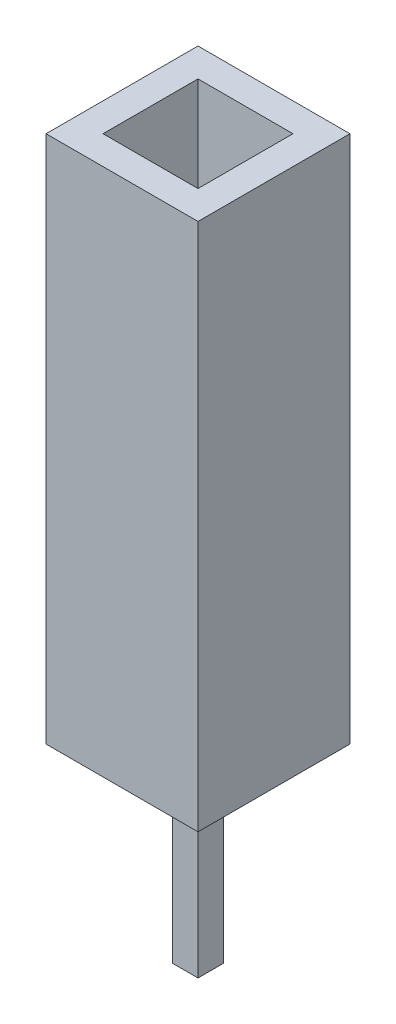
ISO-10303-21;
HEADER;
FILE_DESCRIPTION(('STEP AP214'),'2;1');
FILE_NAME('part.step','',(''),(''),'','','');
FILE_SCHEMA(('AUTOMOTIVE_DESIGN { 1 0 10303 214 1 1 1 1 }'));
ENDSEC;
DATA;
#1=APPLICATION_CONTEXT('core data for automotive mechanical design processes');
#2=APPLICATION_PROTOCOL_DEFINITION('international standard','automotive_design',2000,#1);
#3=PRODUCT_CONTEXT('',#1,'mechanical');
#4=PRODUCT('Part','Part','',(#3));
#5=PRODUCT_RELATED_PRODUCT_CATEGORY('part','',(#4));
#6=PRODUCT_DEFINITION_FORMATION('','',#4);
#7=PRODUCT_DEFINITION_CONTEXT('part definition',#1,'design');
#8=PRODUCT_DEFINITION('design','',#6,#7);
#9=PRODUCT_DEFINITION_SHAPE('','',#8);
#10=(LENGTH_UNIT() NAMED_UNIT(*) SI_UNIT(.MILLI.,.METRE.));
#11=(NAMED_UNIT(*) PLANE_ANGLE_UNIT() SI_UNIT($,.RADIAN.));
#12=(NAMED_UNIT(*) SI_UNIT($,.STERADIAN.) SOLID_ANGLE_UNIT());
#13=UNCERTAINTY_MEASURE_WITH_UNIT(LENGTH_MEASURE(1.E-05),#10,'distance_accuracy_value','');
#14=(GEOMETRIC_REPRESENTATION_CONTEXT(3) GLOBAL_UNCERTAINTY_ASSIGNED_CONTEXT((#13)) GLOBAL_UNIT_ASSIGNED_CONTEXT((#10,
#11,#12)) REPRESENTATION_CONTEXT('',''));
#15=CARTESIAN_POINT('',(0.,0.,0.));
#16=DIRECTION('',(0.,0.,1.));
#17=DIRECTION('',(1.,0.,0.));
#18=AXIS2_PLACEMENT_3D('',#15,#16,#17);
#19=CARTESIAN_POINT('',(-1.2,8.35,-1.2));
#20=DIRECTION('',(1.,0.,0.));
#21=DIRECTION('',(0.,0.,-1.));
#22=AXIS2_PLACEMENT_3D('',#19,#20,#21);
#23=PLANE('',#22);
#24=DIRECTION('',(0.,0.,1.));
#25=VECTOR('',#24,1.);
#26=CARTESIAN_POINT('',(-1.2,0.,-1.2));
#27=LINE('',#26,#25);
#28=CARTESIAN_POINT('',(-1.2,0.,-1.2));
#29=VERTEX_POINT('',#28);
#30=CARTESIAN_POINT('',(-1.2,0.,1.2));
#31=VERTEX_POINT('',#30);
#32=EDGE_CURVE('E181',#29,#31,#27,.T.);
#33=ORIENTED_EDGE('',*,*,#32,.T.);
#34=DIRECTION('',(0.,-1.,0.));
#35=VECTOR('',#34,1.);
#36=CARTESIAN_POINT('',(-1.2,8.35,1.2));
#37=LINE('',#36,#35);
#38=CARTESIAN_POINT('',(-1.2,8.35,1.2));
#39=VERTEX_POINT('',#38);
#40=EDGE_CURVE('E11',#39,#31,#37,.T.);
#41=ORIENTED_EDGE('',*,*,#40,.F.);
#42=DIRECTION('',(0.,0.,1.));
#43=VECTOR('',#42,1.);
#44=CARTESIAN_POINT('',(-1.2,8.35,-1.2));
#45=LINE('',#44,#43);
#46=CARTESIAN_POINT('',(-1.2,8.35,-1.2));
#47=VERTEX_POINT('',#46);
#48=EDGE_CURVE('E188',#47,#39,#45,.T.);
#49=ORIENTED_EDGE('',*,*,#48,.F.);
#50=DIRECTION('',(0.,-1.,0.));
#51=VECTOR('',#50,1.);
#52=CARTESIAN_POINT('',(-1.2,8.35,-1.2));
#53=LINE('',#52,#51);
#54=EDGE_CURVE('E198',#47,#29,#53,.T.);
#55=ORIENTED_EDGE('',*,*,#54,.T.);
#56=EDGE_LOOP('',(#33,#41,#49,#55));
#57=FACE_BOUND('',#56,.T.);
#58=ADVANCED_FACE('F42',(#57),#23,.F.);
#59=CARTESIAN_POINT('',(1.2,8.35,1.2));
#60=DIRECTION('',(0.,0.,-1.));
#61=DIRECTION('',(-1.,0.,0.));
#62=AXIS2_PLACEMENT_3D('',#59,#60,#61);
#63=PLANE('',#62);
#64=DIRECTION('',(1.,0.,0.));
#65=VECTOR('',#64,1.);
#66=CARTESIAN_POINT('',(1.2,0.,1.2));
#67=LINE('',#66,#65);
#68=CARTESIAN_POINT('',(1.2,0.,1.2));
#69=VERTEX_POINT('',#68);
#70=EDGE_CURVE('E201',#31,#69,#67,.T.);
#71=ORIENTED_EDGE('',*,*,#70,.T.);
#72=DIRECTION('',(0.,-1.,0.));
#73=VECTOR('',#72,1.);
#74=CARTESIAN_POINT('',(1.2,8.35,1.2));
#75=LINE('',#74,#73);
#76=CARTESIAN_POINT('',(1.2,8.35,1.2));
#77=VERTEX_POINT('',#76);
#78=EDGE_CURVE('E49',#77,#69,#75,.T.);
#79=ORIENTED_EDGE('',*,*,#78,.F.);
#80=DIRECTION('',(1.,0.,0.));
#81=VECTOR('',#80,1.);
#82=CARTESIAN_POINT('',(1.2,8.35,1.2));
#83=LINE('',#82,#81);
#84=EDGE_CURVE('E191',#39,#77,#83,.T.);
#85=ORIENTED_EDGE('',*,*,#84,.F.);
#86=ORIENTED_EDGE('',*,*,#40,.T.);
#87=EDGE_LOOP('',(#71,#79,#85,#86));
#88=FACE_BOUND('',#87,.T.);
#89=ADVANCED_FACE('F231',(#88),#63,.F.);
#90=CARTESIAN_POINT('',(1.2,8.35,-1.2));
#91=DIRECTION('',(-1.,0.,0.));
#92=DIRECTION('',(0.,0.,1.));
#93=AXIS2_PLACEMENT_3D('',#90,#91,#92);
#94=PLANE('',#93);
#95=DIRECTION('',(0.,0.,-1.));
#96=VECTOR('',#95,1.);
#97=CARTESIAN_POINT('',(1.2,0.,-1.2));
#98=LINE('',#97,#96);
#99=CARTESIAN_POINT('',(1.2,0.,-1.2));
#100=VERTEX_POINT('',#99);
#101=EDGE_CURVE('E203',#69,#100,#98,.T.);
#102=ORIENTED_EDGE('',*,*,#101,.T.);
#103=DIRECTION('',(0.,-1.,0.));
#104=VECTOR('',#103,1.);
#105=CARTESIAN_POINT('',(1.2,8.35,-1.2));
#106=LINE('',#105,#104);
#107=CARTESIAN_POINT('',(1.2,8.35,-1.2));
#108=VERTEX_POINT('',#107);
#109=EDGE_CURVE('E208',#108,#100,#106,.T.);
#110=ORIENTED_EDGE('',*,*,#109,.F.);
#111=DIRECTION('',(0.,0.,-1.));
#112=VECTOR('',#111,1.);
#113=CARTESIAN_POINT('',(1.2,8.35,-1.2));
#114=LINE('',#113,#112);
#115=EDGE_CURVE('E194',#77,#108,#114,.T.);
#116=ORIENTED_EDGE('',*,*,#115,.F.);
#117=ORIENTED_EDGE('',*,*,#78,.T.);
#118=EDGE_LOOP('',(#102,#110,#116,#117));
#119=FACE_BOUND('',#118,.T.);
#120=ADVANCED_FACE('F215',(#119),#94,.F.);
#121=CARTESIAN_POINT('',(1.2,8.35,-1.2));
#122=DIRECTION('',(0.,0.,1.));
#123=DIRECTION('',(1.,0.,0.));
#124=AXIS2_PLACEMENT_3D('',#121,#122,#123);
#125=PLANE('',#124);
#126=DIRECTION('',(-1.,0.,0.));
#127=VECTOR('',#126,1.);
#128=CARTESIAN_POINT('',(1.2,0.,-1.2));
#129=LINE('',#128,#127);
#130=EDGE_CURVE('E192',#100,#29,#129,.T.);
#131=ORIENTED_EDGE('',*,*,#130,.T.);
#132=ORIENTED_EDGE('',*,*,#54,.F.);
#133=DIRECTION('',(-1.,0.,0.));
#134=VECTOR('',#133,1.);
#135=CARTESIAN_POINT('',(1.2,8.35,-1.2));
#136=LINE('',#135,#134);
#137=EDGE_CURVE('E196',#108,#47,#136,.T.);
#138=ORIENTED_EDGE('',*,*,#137,.F.);
#139=ORIENTED_EDGE('',*,*,#109,.T.);
#140=EDGE_LOOP('',(#131,#132,#138,#139));
#141=FACE_BOUND('',#140,.T.);
#142=ADVANCED_FACE('F224',(#141),#125,.F.);
#143=CARTESIAN_POINT('',(0.,8.35,0.));
#144=DIRECTION('',(0.,-1.,0.));
#145=DIRECTION('',(0.,0.,-1.));
#146=AXIS2_PLACEMENT_3D('',#143,#144,#145);
#147=PLANE('',#146);
#148=DIRECTION('',(-1.,0.,0.));
#149=VECTOR('',#148,1.);
#150=CARTESIAN_POINT('',(-0.75,8.35,-0.75));
#151=LINE('',#150,#149);
#152=CARTESIAN_POINT('',(0.75,8.35,-0.75));
#153=VERTEX_POINT('',#152);
#154=CARTESIAN_POINT('',(-0.75,8.35,-0.75));
#155=VERTEX_POINT('',#154);
#156=EDGE_CURVE('E152',#153,#155,#151,.T.);
#157=ORIENTED_EDGE('',*,*,#156,.F.);
#158=DIRECTION('',(0.,0.,-1.));
#159=VECTOR('',#158,1.);
#160=CARTESIAN_POINT('',(0.75,8.35,0.75));
#161=LINE('',#160,#159);
#162=CARTESIAN_POINT('',(0.75,8.35,0.75));
#163=VERTEX_POINT('',#162);
#164=EDGE_CURVE('E150',#163,#153,#161,.T.);
#165=ORIENTED_EDGE('',*,*,#164,.F.);
#166=DIRECTION('',(1.,0.,0.));
#167=VECTOR('',#166,1.);
#168=CARTESIAN_POINT('',(-0.75,8.35,0.75));
#169=LINE('',#168,#167);
#170=CARTESIAN_POINT('',(-0.75,8.35,0.75));
#171=VERTEX_POINT('',#170);
#172=EDGE_CURVE('E162',#171,#163,#169,.T.);
#173=ORIENTED_EDGE('',*,*,#172,.F.);
#174=DIRECTION('',(0.,0.,1.));
#175=VECTOR('',#174,1.);
#176=CARTESIAN_POINT('',(-0.75,8.35,0.75));
#177=LINE('',#176,#175);
#178=EDGE_CURVE('E174',#155,#171,#177,.T.);
#179=ORIENTED_EDGE('',*,*,#178,.F.);
#180=EDGE_LOOP('',(#157,#165,#173,#179));
#181=FACE_BOUND('',#180,.T.);
#182=ORIENTED_EDGE('',*,*,#48,.T.);
#183=ORIENTED_EDGE('',*,*,#84,.T.);
#184=ORIENTED_EDGE('',*,*,#115,.T.);
#185=ORIENTED_EDGE('',*,*,#137,.T.);
#186=EDGE_LOOP('',(#182,#183,#184,#185));
#187=FACE_BOUND('',#186,.T.);
#188=ADVANCED_FACE('F230',(#181,#187),#147,.F.);
#189=CARTESIAN_POINT('',(0.,0.,0.));
#190=DIRECTION('',(0.,-1.,0.));
#191=DIRECTION('',(0.,0.,-1.));
#192=AXIS2_PLACEMENT_3D('',#189,#190,#191);
#193=PLANE('',#192);
#194=DIRECTION('',(0.,0.,1.));
#195=VECTOR('',#194,1.);
#196=CARTESIAN_POINT('',(0.2,0.,0.2));
#197=LINE('',#196,#195);
#198=CARTESIAN_POINT('',(0.2,0.,-0.2));
#199=VERTEX_POINT('',#198);
#200=CARTESIAN_POINT('',(0.2,0.,0.2));
#201=VERTEX_POINT('',#200);
#202=EDGE_CURVE('E56',#199,#201,#197,.T.);
#203=ORIENTED_EDGE('',*,*,#202,.F.);
#204=DIRECTION('',(1.,0.,0.));
#205=VECTOR('',#204,1.);
#206=CARTESIAN_POINT('',(-0.2,0.,-0.2));
#207=LINE('',#206,#205);
#208=CARTESIAN_POINT('',(-0.2,0.,-0.2));
#209=VERTEX_POINT('',#208);
#210=EDGE_CURVE('E60',#209,#199,#207,.T.);
#211=ORIENTED_EDGE('',*,*,#210,.F.);
#212=DIRECTION('',(0.,0.,-1.));
#213=VECTOR('',#212,1.);
#214=CARTESIAN_POINT('',(-0.2,0.,0.2));
#215=LINE('',#214,#213);
#216=CARTESIAN_POINT('',(-0.2,0.,0.2));
#217=VERTEX_POINT('',#216);
#218=EDGE_CURVE('E440',#217,#209,#215,.T.);
#219=ORIENTED_EDGE('',*,*,#218,.F.);
#220=DIRECTION('',(-1.,0.,0.));
#221=VECTOR('',#220,1.);
#222=CARTESIAN_POINT('',(-0.2,0.,0.2));
#223=LINE('',#222,#221);
#224=EDGE_CURVE('E446',#201,#217,#223,.T.);
#225=ORIENTED_EDGE('',*,*,#224,.F.);
#226=EDGE_LOOP('',(#203,#211,#219,#225));
#227=FACE_BOUND('',#226,.T.);
#228=ORIENTED_EDGE('',*,*,#32,.F.);
#229=ORIENTED_EDGE('',*,*,#130,.F.);
#230=ORIENTED_EDGE('',*,*,#101,.F.);
#231=ORIENTED_EDGE('',*,*,#70,.F.);
#232=EDGE_LOOP('',(#228,#229,#230,#231));
#233=FACE_BOUND('',#232,.T.);
#234=ADVANCED_FACE('F221',(#227,#233),#193,.T.);
#235=CARTESIAN_POINT('',(0.75,0.35,0.75));
#236=DIRECTION('',(1.,0.,0.));
#237=DIRECTION('',(0.,0.,-1.));
#238=AXIS2_PLACEMENT_3D('',#235,#236,#237);
#239=PLANE('',#238);
#240=ORIENTED_EDGE('',*,*,#164,.T.);
#241=DIRECTION('',(0.,1.,0.));
#242=VECTOR('',#241,1.);
#243=CARTESIAN_POINT('',(0.75,0.35,-0.75));
#244=LINE('',#243,#242);
#245=CARTESIAN_POINT('',(0.75,0.35,-0.75));
#246=VERTEX_POINT('',#245);
#247=EDGE_CURVE('E170',#246,#153,#244,.T.);
#248=ORIENTED_EDGE('',*,*,#247,.F.);
#249=DIRECTION('',(0.,0.,-1.));
#250=VECTOR('',#249,1.);
#251=CARTESIAN_POINT('',(0.75,0.35,0.75));
#252=LINE('',#251,#250);
#253=CARTESIAN_POINT('',(0.75,0.35,0.75));
#254=VERTEX_POINT('',#253);
#255=EDGE_CURVE('E158',#254,#246,#252,.T.);
#256=ORIENTED_EDGE('',*,*,#255,.F.);
#257=DIRECTION('',(0.,1.,0.));
#258=VECTOR('',#257,1.);
#259=CARTESIAN_POINT('',(0.75,0.35,0.75));
#260=LINE('',#259,#258);
#261=EDGE_CURVE('E179',#254,#163,#260,.T.);
#262=ORIENTED_EDGE('',*,*,#261,.T.);
#263=EDGE_LOOP('',(#240,#248,#256,#262));
#264=FACE_BOUND('',#263,.T.);
#265=ADVANCED_FACE('F243',(#264),#239,.F.);
#266=CARTESIAN_POINT('',(-0.75,0.35,0.75));
#267=DIRECTION('',(0.,0.,1.));
#268=DIRECTION('',(1.,0.,0.));
#269=AXIS2_PLACEMENT_3D('',#266,#267,#268);
#270=PLANE('',#269);
#271=ORIENTED_EDGE('',*,*,#172,.T.);
#272=ORIENTED_EDGE('',*,*,#261,.F.);
#273=DIRECTION('',(1.,0.,0.));
#274=VECTOR('',#273,1.);
#275=CARTESIAN_POINT('',(-0.75,0.35,0.75));
#276=LINE('',#275,#274);
#277=CARTESIAN_POINT('',(-0.75,0.35,0.75));
#278=VERTEX_POINT('',#277);
#279=EDGE_CURVE('E168',#278,#254,#276,.T.);
#280=ORIENTED_EDGE('',*,*,#279,.F.);
#281=DIRECTION('',(0.,1.,0.));
#282=VECTOR('',#281,1.);
#283=CARTESIAN_POINT('',(-0.75,0.35,0.75));
#284=LINE('',#283,#282);
#285=EDGE_CURVE('E182',#278,#171,#284,.T.);
#286=ORIENTED_EDGE('',*,*,#285,.T.);
#287=EDGE_LOOP('',(#271,#272,#280,#286));
#288=FACE_BOUND('',#287,.T.);
#289=ADVANCED_FACE('F249',(#288),#270,.F.);
#290=CARTESIAN_POINT('',(-0.75,0.35,0.75));
#291=DIRECTION('',(-1.,0.,0.));
#292=DIRECTION('',(0.,0.,1.));
#293=AXIS2_PLACEMENT_3D('',#290,#291,#292);
#294=PLANE('',#293);
#295=ORIENTED_EDGE('',*,*,#178,.T.);
#296=ORIENTED_EDGE('',*,*,#285,.F.);
#297=DIRECTION('',(0.,0.,1.));
#298=VECTOR('',#297,1.);
#299=CARTESIAN_POINT('',(-0.75,0.35,0.75));
#300=LINE('',#299,#298);
#301=CARTESIAN_POINT('',(-0.75,0.35,-0.75));
#302=VERTEX_POINT('',#301);
#303=EDGE_CURVE('E165',#302,#278,#300,.T.);
#304=ORIENTED_EDGE('',*,*,#303,.F.);
#305=DIRECTION('',(0.,1.,0.));
#306=VECTOR('',#305,1.);
#307=CARTESIAN_POINT('',(-0.75,0.35,-0.75));
#308=LINE('',#307,#306);
#309=EDGE_CURVE('E184',#302,#155,#308,.T.);
#310=ORIENTED_EDGE('',*,*,#309,.T.);
#311=EDGE_LOOP('',(#295,#296,#304,#310));
#312=FACE_BOUND('',#311,.T.);
#313=ADVANCED_FACE('F255',(#312),#294,.F.);
#314=CARTESIAN_POINT('',(-0.75,0.35,-0.75));
#315=DIRECTION('',(0.,0.,-1.));
#316=DIRECTION('',(-1.,0.,0.));
#317=AXIS2_PLACEMENT_3D('',#314,#315,#316);
#318=PLANE('',#317);
#319=ORIENTED_EDGE('',*,*,#156,.T.);
#320=ORIENTED_EDGE('',*,*,#309,.F.);
#321=DIRECTION('',(-1.,0.,0.));
#322=VECTOR('',#321,1.);
#323=CARTESIAN_POINT('',(-0.75,0.35,-0.75));
#324=LINE('',#323,#322);
#325=EDGE_CURVE('E161',#246,#302,#324,.T.);
#326=ORIENTED_EDGE('',*,*,#325,.F.);
#327=ORIENTED_EDGE('',*,*,#247,.T.);
#328=EDGE_LOOP('',(#319,#320,#326,#327));
#329=FACE_BOUND('',#328,.T.);
#330=ADVANCED_FACE('F251',(#329),#318,.F.);
#331=CARTESIAN_POINT('',(0.,0.35,0.));
#332=DIRECTION('',(0.,-1.,0.));
#333=DIRECTION('',(0.,0.,-1.));
#334=AXIS2_PLACEMENT_3D('',#331,#332,#333);
#335=PLANE('',#334);
#336=ORIENTED_EDGE('',*,*,#255,.T.);
#337=ORIENTED_EDGE('',*,*,#325,.T.);
#338=ORIENTED_EDGE('',*,*,#303,.T.);
#339=ORIENTED_EDGE('',*,*,#279,.T.);
#340=EDGE_LOOP('',(#336,#337,#338,#339));
#341=FACE_BOUND('',#340,.T.);
#342=ADVANCED_FACE('F254',(#341),#335,.F.);
#343=CARTESIAN_POINT('',(0.2,-3.,0.2));
#344=DIRECTION('',(-1.,0.,0.));
#345=DIRECTION('',(0.,0.,1.));
#346=AXIS2_PLACEMENT_3D('',#343,#344,#345);
#347=PLANE('',#346);
#348=ORIENTED_EDGE('',*,*,#202,.T.);
#349=DIRECTION('',(0.,1.,0.));
#350=VECTOR('',#349,1.);
#351=CARTESIAN_POINT('',(0.2,-3.,0.2));
#352=LINE('',#351,#350);
#353=CARTESIAN_POINT('',(0.2,-3.,0.2));
#354=VERTEX_POINT('',#353);
#355=EDGE_CURVE('E133',#354,#201,#352,.T.);
#356=ORIENTED_EDGE('',*,*,#355,.F.);
#357=DIRECTION('',(0.,0.,1.));
#358=VECTOR('',#357,1.);
#359=CARTESIAN_POINT('',(0.2,-3.,0.2));
#360=LINE('',#359,#358);
#361=CARTESIAN_POINT('',(0.2,-3.,-0.2));
#362=VERTEX_POINT('',#361);
#363=EDGE_CURVE('E139',#362,#354,#360,.T.);
#364=ORIENTED_EDGE('',*,*,#363,.F.);
#365=DIRECTION('',(0.,1.,0.));
#366=VECTOR('',#365,1.);
#367=CARTESIAN_POINT('',(0.2,-3.,-0.2));
#368=LINE('',#367,#366);
#369=EDGE_CURVE('E438',#362,#199,#368,.T.);
#370=ORIENTED_EDGE('',*,*,#369,.T.);
#371=EDGE_LOOP('',(#348,#356,#364,#370));
#372=FACE_BOUND('',#371,.T.);
#373=ADVANCED_FACE('F149',(#372),#347,.F.);
#374=CARTESIAN_POINT('',(-0.2,-3.,0.2));
#375=DIRECTION('',(0.,0.,-1.));
#376=DIRECTION('',(-1.,0.,0.));
#377=AXIS2_PLACEMENT_3D('',#374,#375,#376);
#378=PLANE('',#377);
#379=ORIENTED_EDGE('',*,*,#224,.T.);
#380=DIRECTION('',(0.,1.,0.));
#381=VECTOR('',#380,1.);
#382=CARTESIAN_POINT('',(-0.2,-3.,0.2));
#383=LINE('',#382,#381);
#384=CARTESIAN_POINT('',(-0.2,-3.,0.2));
#385=VERTEX_POINT('',#384);
#386=EDGE_CURVE('E135',#385,#217,#383,.T.);
#387=ORIENTED_EDGE('',*,*,#386,.F.);
#388=DIRECTION('',(-1.,0.,0.));
#389=VECTOR('',#388,1.);
#390=CARTESIAN_POINT('',(-0.2,-3.,0.2));
#391=LINE('',#390,#389);
#392=EDGE_CURVE('E128',#354,#385,#391,.T.);
#393=ORIENTED_EDGE('',*,*,#392,.F.);
#394=ORIENTED_EDGE('',*,*,#355,.T.);
#395=EDGE_LOOP('',(#379,#387,#393,#394));
#396=FACE_BOUND('',#395,.T.);
#397=ADVANCED_FACE('F131',(#396),#378,.F.);
#398=CARTESIAN_POINT('',(-0.2,-3.,0.2));
#399=DIRECTION('',(1.,0.,0.));
#400=DIRECTION('',(0.,0.,-1.));
#401=AXIS2_PLACEMENT_3D('',#398,#399,#400);
#402=PLANE('',#401);
#403=ORIENTED_EDGE('',*,*,#218,.T.);
#404=DIRECTION('',(0.,1.,0.));
#405=VECTOR('',#404,1.);
#406=CARTESIAN_POINT('',(-0.2,-3.,-0.2));
#407=LINE('',#406,#405);
#408=CARTESIAN_POINT('',(-0.2,-3.,-0.2));
#409=VERTEX_POINT('',#408);
#410=EDGE_CURVE('E154',#409,#209,#407,.T.);
#411=ORIENTED_EDGE('',*,*,#410,.F.);
#412=DIRECTION('',(0.,0.,-1.));
#413=VECTOR('',#412,1.);
#414=CARTESIAN_POINT('',(-0.2,-3.,0.2));
#415=LINE('',#414,#413);
#416=EDGE_CURVE('E138',#385,#409,#415,.T.);
#417=ORIENTED_EDGE('',*,*,#416,.F.);
#418=ORIENTED_EDGE('',*,*,#386,.T.);
#419=EDGE_LOOP('',(#403,#411,#417,#418));
#420=FACE_BOUND('',#419,.T.);
#421=ADVANCED_FACE('F270',(#420),#402,.F.);
#422=CARTESIAN_POINT('',(-0.2,-3.,-0.2));
#423=DIRECTION('',(0.,0.,1.));
#424=DIRECTION('',(1.,0.,0.));
#425=AXIS2_PLACEMENT_3D('',#422,#423,#424);
#426=PLANE('',#425);
#427=ORIENTED_EDGE('',*,*,#210,.T.);
#428=ORIENTED_EDGE('',*,*,#369,.F.);
#429=DIRECTION('',(1.,0.,0.));
#430=VECTOR('',#429,1.);
#431=CARTESIAN_POINT('',(-0.2,-3.,-0.2));
#432=LINE('',#431,#430);
#433=EDGE_CURVE('E144',#409,#362,#432,.T.);
#434=ORIENTED_EDGE('',*,*,#433,.F.);
#435=ORIENTED_EDGE('',*,*,#410,.T.);
#436=EDGE_LOOP('',(#427,#428,#434,#435));
#437=FACE_BOUND('',#436,.T.);
#438=ADVANCED_FACE('F273',(#437),#426,.F.);
#439=CARTESIAN_POINT('',(0.,-3.,0.));
#440=DIRECTION('',(0.,-1.,0.));
#441=DIRECTION('',(0.,0.,-1.));
#442=AXIS2_PLACEMENT_3D('',#439,#440,#441);
#443=PLANE('',#442);
#444=ORIENTED_EDGE('',*,*,#363,.T.);
#445=ORIENTED_EDGE('',*,*,#392,.T.);
#446=ORIENTED_EDGE('',*,*,#416,.T.);
#447=ORIENTED_EDGE('',*,*,#433,.T.);
#448=EDGE_LOOP('',(#444,#445,#446,#447));
#449=FACE_BOUND('',#448,.T.);
#450=ADVANCED_FACE('F142',(#449),#443,.T.);
#451=CLOSED_SHELL('',(#58,#89,#120,#142,#188,#234,#265,#289,#313,#330,#342,#373,#397,#421,#438,#450));
#452=MANIFOLD_SOLID_BREP('B2',#451);
#453=ADVANCED_BREP_SHAPE_REPRESENTATION('',(#18,#452),#14);
#454=SHAPE_DEFINITION_REPRESENTATION(#9,#453);
ENDSEC;
END-ISO-10303-21;
